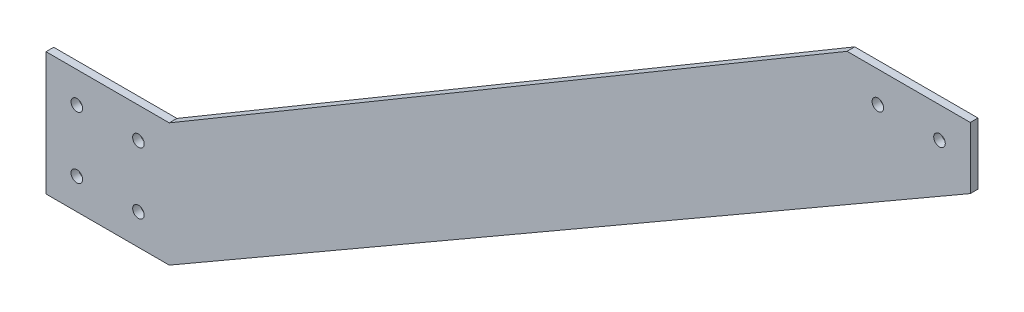
ISO-10303-21;
HEADER;
FILE_DESCRIPTION(('STEP AP214'),'2;1');
FILE_NAME('part.step','',(''),(''),'','','');
FILE_SCHEMA(('AUTOMOTIVE_DESIGN { 1 0 10303 214 1 1 1 1 }'));
ENDSEC;
DATA;
#1=APPLICATION_CONTEXT('core data for automotive mechanical design processes');
#2=APPLICATION_PROTOCOL_DEFINITION('international standard','automotive_design',2000,#1);
#3=PRODUCT_CONTEXT('',#1,'mechanical');
#4=PRODUCT('Part','Part','',(#3));
#5=PRODUCT_RELATED_PRODUCT_CATEGORY('part','',(#4));
#6=PRODUCT_DEFINITION_FORMATION('','',#4);
#7=PRODUCT_DEFINITION_CONTEXT('part definition',#1,'design');
#8=PRODUCT_DEFINITION('design','',#6,#7);
#9=PRODUCT_DEFINITION_SHAPE('','',#8);
#10=(LENGTH_UNIT() NAMED_UNIT(*) SI_UNIT(.MILLI.,.METRE.));
#11=(NAMED_UNIT(*) PLANE_ANGLE_UNIT() SI_UNIT($,.RADIAN.));
#12=(NAMED_UNIT(*) SI_UNIT($,.STERADIAN.) SOLID_ANGLE_UNIT());
#13=UNCERTAINTY_MEASURE_WITH_UNIT(LENGTH_MEASURE(1.E-05),#10,'distance_accuracy_value','');
#14=(GEOMETRIC_REPRESENTATION_CONTEXT(3) GLOBAL_UNCERTAINTY_ASSIGNED_CONTEXT((#13)) GLOBAL_UNIT_ASSIGNED_CONTEXT((#10,
#11,#12)) REPRESENTATION_CONTEXT('',''));
#15=CARTESIAN_POINT('',(0.,0.,0.));
#16=DIRECTION('',(0.,0.,1.));
#17=DIRECTION('',(1.,0.,0.));
#18=AXIS2_PLACEMENT_3D('',#15,#16,#17);
#19=CARTESIAN_POINT('',(50.8,0.,3.175));
#20=DIRECTION('',(0.,1.,0.));
#21=DIRECTION('',(-1.,0.,0.));
#22=AXIS2_PLACEMENT_3D('',#19,#20,#21);
#23=PLANE('',#22);
#24=DIRECTION('',(1.,0.,0.));
#25=VECTOR('',#24,1.);
#26=CARTESIAN_POINT('',(50.8,0.,0.));
#27=LINE('',#26,#25);
#28=CARTESIAN_POINT('',(0.,0.,0.));
#29=VERTEX_POINT('',#28);
#30=CARTESIAN_POINT('',(50.8,0.,0.));
#31=VERTEX_POINT('',#30);
#32=EDGE_CURVE('E127',#29,#31,#27,.T.);
#33=ORIENTED_EDGE('',*,*,#32,.T.);
#34=DIRECTION('',(0.,0.,-1.));
#35=VECTOR('',#34,1.);
#36=CARTESIAN_POINT('',(50.8,0.,3.175));
#37=LINE('',#36,#35);
#38=CARTESIAN_POINT('',(50.8,0.,3.175));
#39=VERTEX_POINT('',#38);
#40=EDGE_CURVE('E11',#39,#31,#37,.T.);
#41=ORIENTED_EDGE('',*,*,#40,.F.);
#42=DIRECTION('',(1.,0.,0.));
#43=VECTOR('',#42,1.);
#44=CARTESIAN_POINT('',(50.8,0.,3.175));
#45=LINE('',#44,#43);
#46=CARTESIAN_POINT('',(0.,0.,3.175));
#47=VERTEX_POINT('',#46);
#48=EDGE_CURVE('E140',#47,#39,#45,.T.);
#49=ORIENTED_EDGE('',*,*,#48,.F.);
#50=DIRECTION('',(0.,0.,-1.));
#51=VECTOR('',#50,1.);
#52=CARTESIAN_POINT('',(0.,0.,3.175));
#53=LINE('',#52,#51);
#54=EDGE_CURVE('E123',#47,#29,#53,.T.);
#55=ORIENTED_EDGE('',*,*,#54,.T.);
#56=EDGE_LOOP('',(#33,#41,#49,#55));
#57=FACE_BOUND('',#56,.T.);
#58=ADVANCED_FACE('F37',(#57),#23,.F.);
#59=CARTESIAN_POINT('',(50.8,0.,3.175));
#60=DIRECTION('',(-0.499999999999995,0.866025403784442,0.));
#61=DIRECTION('',(-0.866025403784442,-0.499999999999995,0.));
#62=AXIS2_PLACEMENT_3D('',#59,#60,#61);
#63=PLANE('',#62);
#64=DIRECTION('',(0.866025403784441,0.499999999999995,0.));
#65=VECTOR('',#64,1.);
#66=CARTESIAN_POINT('',(50.8,0.,0.));
#67=LINE('',#66,#65);
#68=CARTESIAN_POINT('',(381.,190.641058886412,0.));
#69=VERTEX_POINT('',#68);
#70=EDGE_CURVE('E130',#31,#69,#67,.T.);
#71=ORIENTED_EDGE('',*,*,#70,.T.);
#72=DIRECTION('',(0.,0.,-1.));
#73=VECTOR('',#72,1.);
#74=CARTESIAN_POINT('',(381.,190.641058886412,3.175));
#75=LINE('',#74,#73);
#76=CARTESIAN_POINT('',(381.,190.641058886412,3.175));
#77=VERTEX_POINT('',#76);
#78=EDGE_CURVE('E45',#77,#69,#75,.T.);
#79=ORIENTED_EDGE('',*,*,#78,.F.);
#80=DIRECTION('',(0.866025403784441,0.499999999999995,0.));
#81=VECTOR('',#80,1.);
#82=CARTESIAN_POINT('',(50.8,0.,3.175));
#83=LINE('',#82,#81);
#84=EDGE_CURVE('E93',#39,#77,#83,.T.);
#85=ORIENTED_EDGE('',*,*,#84,.F.);
#86=ORIENTED_EDGE('',*,*,#40,.T.);
#87=EDGE_LOOP('',(#71,#79,#85,#86));
#88=FACE_BOUND('',#87,.T.);
#89=ADVANCED_FACE('F224',(#88),#63,.F.);
#90=CARTESIAN_POINT('',(381.,190.641058886412,3.175));
#91=DIRECTION('',(-1.,0.,0.));
#92=DIRECTION('',(0.,-1.,0.));
#93=AXIS2_PLACEMENT_3D('',#90,#91,#92);
#94=PLANE('',#93);
#95=DIRECTION('',(0.,1.,0.));
#96=VECTOR('',#95,1.);
#97=CARTESIAN_POINT('',(381.,190.641058886412,0.));
#98=LINE('',#97,#96);
#99=CARTESIAN_POINT('',(381.,216.041058886412,0.));
#100=VERTEX_POINT('',#99);
#101=EDGE_CURVE('E133',#69,#100,#98,.T.);
#102=ORIENTED_EDGE('',*,*,#101,.T.);
#103=DIRECTION('',(0.,0.,-1.));
#104=VECTOR('',#103,1.);
#105=CARTESIAN_POINT('',(381.,216.041058886412,3.175));
#106=LINE('',#105,#104);
#107=CARTESIAN_POINT('',(381.,216.041058886412,3.175));
#108=VERTEX_POINT('',#107);
#109=EDGE_CURVE('E144',#108,#100,#106,.T.);
#110=ORIENTED_EDGE('',*,*,#109,.F.);
#111=DIRECTION('',(0.,1.,0.));
#112=VECTOR('',#111,1.);
#113=CARTESIAN_POINT('',(381.,190.641058886412,3.175));
#114=LINE('',#113,#112);
#115=EDGE_CURVE('E152',#77,#108,#114,.T.);
#116=ORIENTED_EDGE('',*,*,#115,.F.);
#117=ORIENTED_EDGE('',*,*,#78,.T.);
#118=EDGE_LOOP('',(#102,#110,#116,#117));
#119=FACE_BOUND('',#118,.T.);
#120=ADVANCED_FACE('F150',(#119),#94,.F.);
#121=CARTESIAN_POINT('',(381.,216.041058886412,3.175));
#122=DIRECTION('',(0.,-1.,0.));
#123=DIRECTION('',(0.,0.,-1.));
#124=AXIS2_PLACEMENT_3D('',#121,#122,#123);
#125=PLANE('',#124);
#126=DIRECTION('',(-1.,0.,0.));
#127=VECTOR('',#126,1.);
#128=CARTESIAN_POINT('',(381.,216.041058886412,0.));
#129=LINE('',#128,#127);
#130=CARTESIAN_POINT('',(330.2,216.041058886412,0.));
#131=VERTEX_POINT('',#130);
#132=EDGE_CURVE('E135',#100,#131,#129,.T.);
#133=ORIENTED_EDGE('',*,*,#132,.T.);
#134=DIRECTION('',(0.,0.,-1.));
#135=VECTOR('',#134,1.);
#136=CARTESIAN_POINT('',(330.2,216.041058886412,3.175));
#137=LINE('',#136,#135);
#138=CARTESIAN_POINT('',(330.2,216.041058886412,3.175));
#139=VERTEX_POINT('',#138);
#140=EDGE_CURVE('E118',#139,#131,#137,.T.);
#141=ORIENTED_EDGE('',*,*,#140,.F.);
#142=DIRECTION('',(-1.,0.,0.));
#143=VECTOR('',#142,1.);
#144=CARTESIAN_POINT('',(381.,216.041058886412,3.175));
#145=LINE('',#144,#143);
#146=EDGE_CURVE('E109',#108,#139,#145,.T.);
#147=ORIENTED_EDGE('',*,*,#146,.F.);
#148=ORIENTED_EDGE('',*,*,#109,.T.);
#149=EDGE_LOOP('',(#133,#141,#147,#148));
#150=FACE_BOUND('',#149,.T.);
#151=ADVANCED_FACE('F158',(#150),#125,.F.);
#152=CARTESIAN_POINT('',(50.8,50.8,3.175));
#153=DIRECTION('',(0.509051365803282,-0.86073614248143,0.));
#154=DIRECTION('',(0.86073614248143,0.509051365803282,0.));
#155=AXIS2_PLACEMENT_3D('',#152,#153,#154);
#156=PLANE('',#155);
#157=DIRECTION('',(-0.86073614248143,-0.509051365803282,0.));
#158=VECTOR('',#157,1.);
#159=CARTESIAN_POINT('',(50.8,50.8,0.));
#160=LINE('',#159,#158);
#161=CARTESIAN_POINT('',(50.8,50.8,0.));
#162=VERTEX_POINT('',#161);
#163=EDGE_CURVE('E117',#131,#162,#160,.T.);
#164=ORIENTED_EDGE('',*,*,#163,.T.);
#165=DIRECTION('',(0.,0.,-1.));
#166=VECTOR('',#165,1.);
#167=CARTESIAN_POINT('',(50.8,50.8,3.175));
#168=LINE('',#167,#166);
#169=CARTESIAN_POINT('',(50.8,50.8,3.175));
#170=VERTEX_POINT('',#169);
#171=EDGE_CURVE('E114',#170,#162,#168,.T.);
#172=ORIENTED_EDGE('',*,*,#171,.F.);
#173=DIRECTION('',(-0.86073614248143,-0.509051365803282,0.));
#174=VECTOR('',#173,1.);
#175=CARTESIAN_POINT('',(50.8,50.8,3.175));
#176=LINE('',#175,#174);
#177=EDGE_CURVE('E103',#139,#170,#176,.T.);
#178=ORIENTED_EDGE('',*,*,#177,.F.);
#179=ORIENTED_EDGE('',*,*,#140,.T.);
#180=EDGE_LOOP('',(#164,#172,#178,#179));
#181=FACE_BOUND('',#180,.T.);
#182=ADVANCED_FACE('F115',(#181),#156,.F.);
#183=CARTESIAN_POINT('',(0.,50.8,3.175));
#184=DIRECTION('',(0.,-1.,0.));
#185=DIRECTION('',(0.,0.,-1.));
#186=AXIS2_PLACEMENT_3D('',#183,#184,#185);
#187=PLANE('',#186);
#188=DIRECTION('',(-1.,0.,0.));
#189=VECTOR('',#188,1.);
#190=CARTESIAN_POINT('',(0.,50.8,0.));
#191=LINE('',#190,#189);
#192=CARTESIAN_POINT('',(0.,50.8,0.));
#193=VERTEX_POINT('',#192);
#194=EDGE_CURVE('E79',#162,#193,#191,.T.);
#195=ORIENTED_EDGE('',*,*,#194,.T.);
#196=DIRECTION('',(0.,0.,-1.));
#197=VECTOR('',#196,1.);
#198=CARTESIAN_POINT('',(0.,50.8,3.175));
#199=LINE('',#198,#197);
#200=CARTESIAN_POINT('',(0.,50.8,3.175));
#201=VERTEX_POINT('',#200);
#202=EDGE_CURVE('E119',#201,#193,#199,.T.);
#203=ORIENTED_EDGE('',*,*,#202,.F.);
#204=DIRECTION('',(-1.,0.,0.));
#205=VECTOR('',#204,1.);
#206=CARTESIAN_POINT('',(0.,50.8,3.175));
#207=LINE('',#206,#205);
#208=EDGE_CURVE('E107',#170,#201,#207,.T.);
#209=ORIENTED_EDGE('',*,*,#208,.F.);
#210=ORIENTED_EDGE('',*,*,#171,.T.);
#211=EDGE_LOOP('',(#195,#203,#209,#210));
#212=FACE_BOUND('',#211,.T.);
#213=ADVANCED_FACE('F121',(#212),#187,.F.);
#214=CARTESIAN_POINT('',(0.,50.8,3.175));
#215=DIRECTION('',(1.,0.,0.));
#216=DIRECTION('',(0.,0.,-1.));
#217=AXIS2_PLACEMENT_3D('',#214,#215,#216);
#218=PLANE('',#217);
#219=DIRECTION('',(0.,-1.,0.));
#220=VECTOR('',#219,1.);
#221=CARTESIAN_POINT('',(0.,50.8,0.));
#222=LINE('',#221,#220);
#223=EDGE_CURVE('E85',#193,#29,#222,.T.);
#224=ORIENTED_EDGE('',*,*,#223,.T.);
#225=ORIENTED_EDGE('',*,*,#54,.F.);
#226=DIRECTION('',(0.,-1.,0.));
#227=VECTOR('',#226,1.);
#228=CARTESIAN_POINT('',(0.,50.8,3.175));
#229=LINE('',#228,#227);
#230=EDGE_CURVE('E53',#201,#47,#229,.T.);
#231=ORIENTED_EDGE('',*,*,#230,.F.);
#232=ORIENTED_EDGE('',*,*,#202,.T.);
#233=EDGE_LOOP('',(#224,#225,#231,#232));
#234=FACE_BOUND('',#233,.T.);
#235=ADVANCED_FACE('F203',(#234),#218,.F.);
#236=CARTESIAN_POINT('',(0.,0.,3.175));
#237=DIRECTION('',(0.,0.,1.));
#238=DIRECTION('',(1.,0.,0.));
#239=AXIS2_PLACEMENT_3D('',#236,#237,#238);
#240=PLANE('',#239);
#241=CARTESIAN_POINT('',(12.7,38.1,3.175));
#242=DIRECTION('',(0.,0.,1.));
#243=DIRECTION('',(1.,0.,0.));
#244=AXIS2_PLACEMENT_3D('',#241,#242,#243);
#245=CIRCLE('',#244,2.38125);
#246=CARTESIAN_POINT('',(15.08125,38.1,3.175));
#247=VERTEX_POINT('',#246);
#248=EDGE_CURVE('E166',#247,#247,#245,.T.);
#249=ORIENTED_EDGE('',*,*,#248,.F.);
#250=EDGE_LOOP('',(#249));
#251=FACE_BOUND('',#250,.T.);
#252=CARTESIAN_POINT('',(38.1,12.7,3.175));
#253=DIRECTION('',(0.,0.,1.));
#254=DIRECTION('',(1.,0.,0.));
#255=AXIS2_PLACEMENT_3D('',#252,#253,#254);
#256=CIRCLE('',#255,2.38125);
#257=CARTESIAN_POINT('',(40.48125,12.7,3.175));
#258=VERTEX_POINT('',#257);
#259=EDGE_CURVE('E185',#258,#258,#256,.T.);
#260=ORIENTED_EDGE('',*,*,#259,.F.);
#261=EDGE_LOOP('',(#260));
#262=FACE_BOUND('',#261,.T.);
#263=CARTESIAN_POINT('',(342.9,203.341058886412,3.175));
#264=DIRECTION('',(0.,0.,1.));
#265=DIRECTION('',(-1.,0.,0.));
#266=AXIS2_PLACEMENT_3D('',#263,#264,#265);
#267=CIRCLE('',#266,2.38125000000007);
#268=CARTESIAN_POINT('',(340.51875,203.341058886412,3.175));
#269=VERTEX_POINT('',#268);
#270=EDGE_CURVE('E179',#269,#269,#267,.T.);
#271=ORIENTED_EDGE('',*,*,#270,.F.);
#272=EDGE_LOOP('',(#271));
#273=FACE_BOUND('',#272,.T.);
#274=CARTESIAN_POINT('',(368.3,203.341058886412,3.175));
#275=DIRECTION('',(0.,0.,1.));
#276=DIRECTION('',(-1.,0.,0.));
#277=AXIS2_PLACEMENT_3D('',#274,#275,#276);
#278=CIRCLE('',#277,2.38125000000007);
#279=CARTESIAN_POINT('',(365.91875,203.341058886412,3.175));
#280=VERTEX_POINT('',#279);
#281=EDGE_CURVE('E172',#280,#280,#278,.T.);
#282=ORIENTED_EDGE('',*,*,#281,.F.);
#283=EDGE_LOOP('',(#282));
#284=FACE_BOUND('',#283,.T.);
#285=CARTESIAN_POINT('',(38.1,38.1,3.175));
#286=DIRECTION('',(0.,0.,1.));
#287=DIRECTION('',(1.,0.,0.));
#288=AXIS2_PLACEMENT_3D('',#285,#286,#287);
#289=CIRCLE('',#288,2.38125);
#290=CARTESIAN_POINT('',(40.48125,38.1,3.175));
#291=VERTEX_POINT('',#290);
#292=EDGE_CURVE('E173',#291,#291,#289,.T.);
#293=ORIENTED_EDGE('',*,*,#292,.F.);
#294=EDGE_LOOP('',(#293));
#295=FACE_BOUND('',#294,.T.);
#296=CARTESIAN_POINT('',(12.7,12.7,3.175));
#297=DIRECTION('',(0.,0.,1.));
#298=DIRECTION('',(1.,0.,0.));
#299=AXIS2_PLACEMENT_3D('',#296,#297,#298);
#300=CIRCLE('',#299,2.38125);
#301=CARTESIAN_POINT('',(15.08125,12.7,3.175));
#302=VERTEX_POINT('',#301);
#303=EDGE_CURVE('E163',#302,#302,#300,.T.);
#304=ORIENTED_EDGE('',*,*,#303,.F.);
#305=EDGE_LOOP('',(#304));
#306=FACE_BOUND('',#305,.T.);
#307=ORIENTED_EDGE('',*,*,#48,.T.);
#308=ORIENTED_EDGE('',*,*,#84,.T.);
#309=ORIENTED_EDGE('',*,*,#115,.T.);
#310=ORIENTED_EDGE('',*,*,#146,.T.);
#311=ORIENTED_EDGE('',*,*,#177,.T.);
#312=ORIENTED_EDGE('',*,*,#208,.T.);
#313=ORIENTED_EDGE('',*,*,#230,.T.);
#314=EDGE_LOOP('',(#307,#308,#309,#310,#311,#312,#313));
#315=FACE_BOUND('',#314,.T.);
#316=ADVANCED_FACE('F105',(#251,#262,#273,#284,#295,#306,#315),#240,.T.);
#317=CARTESIAN_POINT('',(0.,0.,0.));
#318=DIRECTION('',(0.,0.,1.));
#319=DIRECTION('',(1.,0.,0.));
#320=AXIS2_PLACEMENT_3D('',#317,#318,#319);
#321=PLANE('',#320);
#322=CARTESIAN_POINT('',(12.7,38.1,0.));
#323=DIRECTION('',(0.,0.,1.));
#324=DIRECTION('',(1.,0.,0.));
#325=AXIS2_PLACEMENT_3D('',#322,#323,#324);
#326=CIRCLE('',#325,2.38125);
#327=CARTESIAN_POINT('',(15.08125,38.1,0.));
#328=VERTEX_POINT('',#327);
#329=EDGE_CURVE('E188',#328,#328,#326,.T.);
#330=ORIENTED_EDGE('',*,*,#329,.T.);
#331=EDGE_LOOP('',(#330));
#332=FACE_BOUND('',#331,.T.);
#333=CARTESIAN_POINT('',(38.1,12.7,0.));
#334=DIRECTION('',(0.,0.,1.));
#335=DIRECTION('',(1.,0.,0.));
#336=AXIS2_PLACEMENT_3D('',#333,#334,#335);
#337=CIRCLE('',#336,2.38125);
#338=CARTESIAN_POINT('',(40.48125,12.7,0.));
#339=VERTEX_POINT('',#338);
#340=EDGE_CURVE('E182',#339,#339,#337,.T.);
#341=ORIENTED_EDGE('',*,*,#340,.T.);
#342=EDGE_LOOP('',(#341));
#343=FACE_BOUND('',#342,.T.);
#344=CARTESIAN_POINT('',(342.9,203.341058886412,0.));
#345=DIRECTION('',(0.,0.,1.));
#346=DIRECTION('',(-1.,0.,0.));
#347=AXIS2_PLACEMENT_3D('',#344,#345,#346);
#348=CIRCLE('',#347,2.38125000000007);
#349=CARTESIAN_POINT('',(340.51875,203.341058886412,0.));
#350=VERTEX_POINT('',#349);
#351=EDGE_CURVE('E176',#350,#350,#348,.T.);
#352=ORIENTED_EDGE('',*,*,#351,.T.);
#353=EDGE_LOOP('',(#352));
#354=FACE_BOUND('',#353,.T.);
#355=CARTESIAN_POINT('',(368.3,203.341058886412,0.));
#356=DIRECTION('',(0.,0.,1.));
#357=DIRECTION('',(-1.,0.,0.));
#358=AXIS2_PLACEMENT_3D('',#355,#356,#357);
#359=CIRCLE('',#358,2.38125000000007);
#360=CARTESIAN_POINT('',(365.91875,203.341058886412,0.));
#361=VERTEX_POINT('',#360);
#362=EDGE_CURVE('E169',#361,#361,#359,.T.);
#363=ORIENTED_EDGE('',*,*,#362,.T.);
#364=EDGE_LOOP('',(#363));
#365=FACE_BOUND('',#364,.T.);
#366=CARTESIAN_POINT('',(38.1,38.1,0.));
#367=DIRECTION('',(0.,0.,1.));
#368=DIRECTION('',(1.,0.,0.));
#369=AXIS2_PLACEMENT_3D('',#366,#367,#368);
#370=CIRCLE('',#369,2.38125);
#371=CARTESIAN_POINT('',(40.48125,38.1,0.));
#372=VERTEX_POINT('',#371);
#373=EDGE_CURVE('E193',#372,#372,#370,.T.);
#374=ORIENTED_EDGE('',*,*,#373,.T.);
#375=EDGE_LOOP('',(#374));
#376=FACE_BOUND('',#375,.T.);
#377=CARTESIAN_POINT('',(12.7,12.7,0.));
#378=DIRECTION('',(0.,0.,1.));
#379=DIRECTION('',(1.,0.,0.));
#380=AXIS2_PLACEMENT_3D('',#377,#378,#379);
#381=CIRCLE('',#380,2.38125);
#382=CARTESIAN_POINT('',(15.08125,12.7,0.));
#383=VERTEX_POINT('',#382);
#384=EDGE_CURVE('E131',#383,#383,#381,.T.);
#385=ORIENTED_EDGE('',*,*,#384,.T.);
#386=EDGE_LOOP('',(#385));
#387=FACE_BOUND('',#386,.T.);
#388=ORIENTED_EDGE('',*,*,#32,.F.);
#389=ORIENTED_EDGE('',*,*,#223,.F.);
#390=ORIENTED_EDGE('',*,*,#194,.F.);
#391=ORIENTED_EDGE('',*,*,#163,.F.);
#392=ORIENTED_EDGE('',*,*,#132,.F.);
#393=ORIENTED_EDGE('',*,*,#101,.F.);
#394=ORIENTED_EDGE('',*,*,#70,.F.);
#395=EDGE_LOOP('',(#388,#389,#390,#391,#392,#393,#394));
#396=FACE_BOUND('',#395,.T.);
#397=ADVANCED_FACE('F156',(#332,#343,#354,#365,#376,#387,#396),#321,.F.);
#398=CARTESIAN_POINT('',(12.7,12.7,0.));
#399=DIRECTION('',(0.,0.,1.));
#400=DIRECTION('',(1.,0.,0.));
#401=AXIS2_PLACEMENT_3D('',#398,#399,#400);
#402=CYLINDRICAL_SURFACE('',#401,2.38125);
#403=ORIENTED_EDGE('',*,*,#384,.F.);
#404=EDGE_LOOP('',(#403));
#405=FACE_BOUND('',#404,.T.);
#406=ORIENTED_EDGE('',*,*,#303,.T.);
#407=EDGE_LOOP('',(#406));
#408=FACE_BOUND('',#407,.T.);
#409=ADVANCED_FACE('F208',(#405,#408),#402,.F.);
#410=CARTESIAN_POINT('',(38.1,38.1,0.));
#411=DIRECTION('',(0.,0.,1.));
#412=DIRECTION('',(1.,0.,0.));
#413=AXIS2_PLACEMENT_3D('',#410,#411,#412);
#414=CYLINDRICAL_SURFACE('',#413,2.38125);
#415=ORIENTED_EDGE('',*,*,#373,.F.);
#416=EDGE_LOOP('',(#415));
#417=FACE_BOUND('',#416,.T.);
#418=ORIENTED_EDGE('',*,*,#292,.T.);
#419=EDGE_LOOP('',(#418));
#420=FACE_BOUND('',#419,.T.);
#421=ADVANCED_FACE('F199',(#417,#420),#414,.F.);
#422=CARTESIAN_POINT('',(368.3,203.341058886412,0.));
#423=DIRECTION('',(0.,0.,1.));
#424=DIRECTION('',(1.,0.,0.));
#425=AXIS2_PLACEMENT_3D('',#422,#423,#424);
#426=CYLINDRICAL_SURFACE('',#425,2.38125000000007);
#427=ORIENTED_EDGE('',*,*,#362,.F.);
#428=EDGE_LOOP('',(#427));
#429=FACE_BOUND('',#428,.T.);
#430=ORIENTED_EDGE('',*,*,#281,.T.);
#431=EDGE_LOOP('',(#430));
#432=FACE_BOUND('',#431,.T.);
#433=ADVANCED_FACE('F216',(#429,#432),#426,.F.);
#434=CARTESIAN_POINT('',(342.9,203.341058886412,0.));
#435=DIRECTION('',(0.,0.,1.));
#436=DIRECTION('',(1.,0.,0.));
#437=AXIS2_PLACEMENT_3D('',#434,#435,#436);
#438=CYLINDRICAL_SURFACE('',#437,2.38125000000007);
#439=ORIENTED_EDGE('',*,*,#351,.F.);
#440=EDGE_LOOP('',(#439));
#441=FACE_BOUND('',#440,.T.);
#442=ORIENTED_EDGE('',*,*,#270,.T.);
#443=EDGE_LOOP('',(#442));
#444=FACE_BOUND('',#443,.T.);
#445=ADVANCED_FACE('F300',(#441,#444),#438,.F.);
#446=CARTESIAN_POINT('',(38.1,12.7,0.));
#447=DIRECTION('',(0.,0.,1.));
#448=DIRECTION('',(1.,0.,0.));
#449=AXIS2_PLACEMENT_3D('',#446,#447,#448);
#450=CYLINDRICAL_SURFACE('',#449,2.38125);
#451=ORIENTED_EDGE('',*,*,#340,.F.);
#452=EDGE_LOOP('',(#451));
#453=FACE_BOUND('',#452,.T.);
#454=ORIENTED_EDGE('',*,*,#259,.T.);
#455=EDGE_LOOP('',(#454));
#456=FACE_BOUND('',#455,.T.);
#457=ADVANCED_FACE('F310',(#453,#456),#450,.F.);
#458=CARTESIAN_POINT('',(12.7,38.1,0.));
#459=DIRECTION('',(0.,0.,1.));
#460=DIRECTION('',(1.,0.,0.));
#461=AXIS2_PLACEMENT_3D('',#458,#459,#460);
#462=CYLINDRICAL_SURFACE('',#461,2.38125);
#463=ORIENTED_EDGE('',*,*,#329,.F.);
#464=EDGE_LOOP('',(#463));
#465=FACE_BOUND('',#464,.T.);
#466=ORIENTED_EDGE('',*,*,#248,.T.);
#467=EDGE_LOOP('',(#466));
#468=FACE_BOUND('',#467,.T.);
#469=ADVANCED_FACE('F321',(#465,#468),#462,.F.);
#470=CLOSED_SHELL('',(#58,#89,#120,#151,#182,#213,#235,#316,#397,#409,#421,#433,#445,#457,#469));
#471=MANIFOLD_SOLID_BREP('B2',#470);
#472=ADVANCED_BREP_SHAPE_REPRESENTATION('',(#18,#471),#14);
#473=SHAPE_DEFINITION_REPRESENTATION(#9,#472);
ENDSEC;
END-ISO-10303-21;
